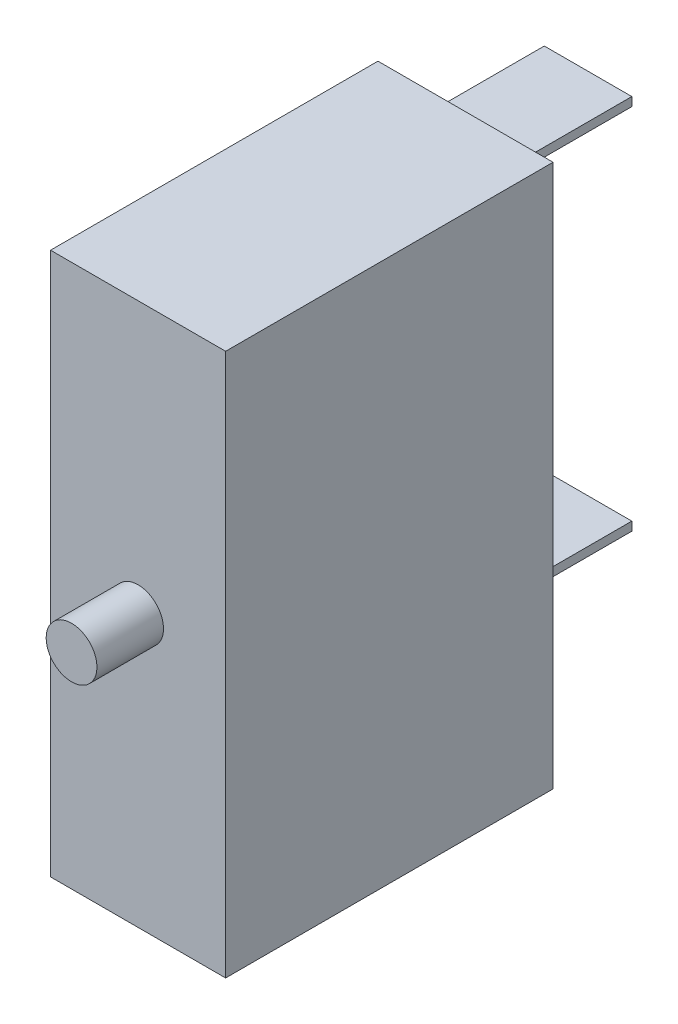
ISO-10303-21;
HEADER;
FILE_DESCRIPTION(('STEP AP214'),'2;1');
FILE_NAME('part.step','',(''),(''),'','','');
FILE_SCHEMA(('AUTOMOTIVE_DESIGN { 1 0 10303 214 1 1 1 1 }'));
ENDSEC;
DATA;
#1=APPLICATION_CONTEXT('core data for automotive mechanical design processes');
#2=APPLICATION_PROTOCOL_DEFINITION('international standard','automotive_design',2000,#1);
#3=PRODUCT_CONTEXT('',#1,'mechanical');
#4=PRODUCT('Part','Part','',(#3));
#5=PRODUCT_RELATED_PRODUCT_CATEGORY('part','',(#4));
#6=PRODUCT_DEFINITION_FORMATION('','',#4);
#7=PRODUCT_DEFINITION_CONTEXT('part definition',#1,'design');
#8=PRODUCT_DEFINITION('design','',#6,#7);
#9=PRODUCT_DEFINITION_SHAPE('','',#8);
#10=(LENGTH_UNIT() NAMED_UNIT(*) SI_UNIT(.MILLI.,.METRE.));
#11=(NAMED_UNIT(*) PLANE_ANGLE_UNIT() SI_UNIT($,.RADIAN.));
#12=(NAMED_UNIT(*) SI_UNIT($,.STERADIAN.) SOLID_ANGLE_UNIT());
#13=UNCERTAINTY_MEASURE_WITH_UNIT(LENGTH_MEASURE(1.E-05),#10,'distance_accuracy_value','');
#14=(GEOMETRIC_REPRESENTATION_CONTEXT(3) GLOBAL_UNCERTAINTY_ASSIGNED_CONTEXT((#13)) GLOBAL_UNIT_ASSIGNED_CONTEXT((#10,
#11,#12)) REPRESENTATION_CONTEXT('',''));
#15=CARTESIAN_POINT('',(0.,0.,0.));
#16=DIRECTION('',(0.,0.,1.));
#17=DIRECTION('',(1.,0.,0.));
#18=AXIS2_PLACEMENT_3D('',#15,#16,#17);
#19=CARTESIAN_POINT('',(-5.,-23.,-18.));
#20=DIRECTION('',(0.,0.,-1.));
#21=DIRECTION('',(-1.,0.,0.));
#22=AXIS2_PLACEMENT_3D('',#19,#20,#21);
#23=PLANE('',#22);
#24=DIRECTION('',(-1.,0.,0.));
#25=VECTOR('',#24,1.);
#26=CARTESIAN_POINT('',(5.,15.5,-18.));
#27=LINE('',#26,#25);
#28=CARTESIAN_POINT('',(5.,15.5,-18.));
#29=VERTEX_POINT('',#28);
#30=CARTESIAN_POINT('',(-5.,15.5,-18.));
#31=VERTEX_POINT('',#30);
#32=EDGE_CURVE('E158',#29,#31,#27,.T.);
#33=ORIENTED_EDGE('',*,*,#32,.F.);
#34=DIRECTION('',(0.,1.,0.));
#35=VECTOR('',#34,1.);
#36=CARTESIAN_POINT('',(5.,-23.,-18.));
#37=LINE('',#36,#35);
#38=CARTESIAN_POINT('',(5.,-15.5,-18.));
#39=VERTEX_POINT('',#38);
#40=EDGE_CURVE('E151',#39,#29,#37,.T.);
#41=ORIENTED_EDGE('',*,*,#40,.F.);
#42=DIRECTION('',(-1.,0.,0.));
#43=VECTOR('',#42,1.);
#44=CARTESIAN_POINT('',(5.,-15.5,-18.));
#45=LINE('',#44,#43);
#46=CARTESIAN_POINT('',(-5.,-15.5,-18.));
#47=VERTEX_POINT('',#46);
#48=EDGE_CURVE('E130',#39,#47,#45,.T.);
#49=ORIENTED_EDGE('',*,*,#48,.T.);
#50=DIRECTION('',(0.,1.,0.));
#51=VECTOR('',#50,1.);
#52=CARTESIAN_POINT('',(-5.,-23.,-18.));
#53=LINE('',#52,#51);
#54=EDGE_CURVE('E150',#47,#31,#53,.T.);
#55=ORIENTED_EDGE('',*,*,#54,.T.);
#56=EDGE_LOOP('',(#33,#41,#49,#55));
#57=FACE_BOUND('',#56,.T.);
#58=DIRECTION('',(-1.,0.,0.));
#59=VECTOR('',#58,1.);
#60=CARTESIAN_POINT('',(-2.5,-7.5,-18.));
#61=LINE('',#60,#59);
#62=CARTESIAN_POINT('',(2.5,-7.5,-18.));
#63=VERTEX_POINT('',#62);
#64=CARTESIAN_POINT('',(-2.5,-7.5,-18.));
#65=VERTEX_POINT('',#64);
#66=EDGE_CURVE('E179',#63,#65,#61,.T.);
#67=ORIENTED_EDGE('',*,*,#66,.F.);
#68=DIRECTION('',(0.,-1.,0.));
#69=VECTOR('',#68,1.);
#70=CARTESIAN_POINT('',(2.5,-7.5,-18.));
#71=LINE('',#70,#69);
#72=CARTESIAN_POINT('',(2.5,-7.,-18.));
#73=VERTEX_POINT('',#72);
#74=EDGE_CURVE('E181',#73,#63,#71,.T.);
#75=ORIENTED_EDGE('',*,*,#74,.F.);
#76=DIRECTION('',(1.,0.,0.));
#77=VECTOR('',#76,1.);
#78=CARTESIAN_POINT('',(2.5,-7.,-18.));
#79=LINE('',#78,#77);
#80=CARTESIAN_POINT('',(-2.5,-7.,-18.));
#81=VERTEX_POINT('',#80);
#82=EDGE_CURVE('E174',#81,#73,#79,.T.);
#83=ORIENTED_EDGE('',*,*,#82,.F.);
#84=DIRECTION('',(0.,1.,0.));
#85=VECTOR('',#84,1.);
#86=CARTESIAN_POINT('',(-2.5,-7.,-18.));
#87=LINE('',#86,#85);
#88=EDGE_CURVE('E177',#65,#81,#87,.T.);
#89=ORIENTED_EDGE('',*,*,#88,.F.);
#90=EDGE_LOOP('',(#67,#75,#83,#89));
#91=FACE_BOUND('',#90,.T.);
#92=DIRECTION('',(-1.,0.,0.));
#93=VECTOR('',#92,1.);
#94=CARTESIAN_POINT('',(-2.5,13.5,-18.));
#95=LINE('',#94,#93);
#96=CARTESIAN_POINT('',(2.5,13.5,-18.));
#97=VERTEX_POINT('',#96);
#98=CARTESIAN_POINT('',(-2.5,13.5,-18.));
#99=VERTEX_POINT('',#98);
#100=EDGE_CURVE('E206',#97,#99,#95,.T.);
#101=ORIENTED_EDGE('',*,*,#100,.F.);
#102=DIRECTION('',(0.,-1.,0.));
#103=VECTOR('',#102,1.);
#104=CARTESIAN_POINT('',(2.5,13.5,-18.));
#105=LINE('',#104,#103);
#106=CARTESIAN_POINT('',(2.5,14.,-18.));
#107=VERTEX_POINT('',#106);
#108=EDGE_CURVE('E208',#107,#97,#105,.T.);
#109=ORIENTED_EDGE('',*,*,#108,.F.);
#110=DIRECTION('',(1.,0.,0.));
#111=VECTOR('',#110,1.);
#112=CARTESIAN_POINT('',(2.5,14.,-18.));
#113=LINE('',#112,#111);
#114=CARTESIAN_POINT('',(-2.5,14.,-18.));
#115=VERTEX_POINT('',#114);
#116=EDGE_CURVE('E201',#115,#107,#113,.T.);
#117=ORIENTED_EDGE('',*,*,#116,.F.);
#118=DIRECTION('',(0.,1.,0.));
#119=VECTOR('',#118,1.);
#120=CARTESIAN_POINT('',(-2.5,14.,-18.));
#121=LINE('',#120,#119);
#122=EDGE_CURVE('E204',#99,#115,#121,.T.);
#123=ORIENTED_EDGE('',*,*,#122,.F.);
#124=EDGE_LOOP('',(#101,#109,#117,#123));
#125=FACE_BOUND('',#124,.T.);
#126=ADVANCED_FACE('F34',(#57,#91,#125),#23,.T.);
#127=CARTESIAN_POINT('',(-5.,23.,0.7));
#128=DIRECTION('',(0.,0.,1.));
#129=DIRECTION('',(1.,0.,0.));
#130=AXIS2_PLACEMENT_3D('',#127,#128,#129);
#131=PLANE('',#130);
#132=DIRECTION('',(1.,0.,0.));
#133=VECTOR('',#132,1.);
#134=CARTESIAN_POINT('',(-5.,15.5,0.7));
#135=LINE('',#134,#133);
#136=CARTESIAN_POINT('',(-5.,15.5,0.7));
#137=VERTEX_POINT('',#136);
#138=CARTESIAN_POINT('',(5.,15.5,0.7));
#139=VERTEX_POINT('',#138);
#140=EDGE_CURVE('E145',#137,#139,#135,.T.);
#141=ORIENTED_EDGE('',*,*,#140,.F.);
#142=DIRECTION('',(0.,-1.,0.));
#143=VECTOR('',#142,1.);
#144=CARTESIAN_POINT('',(-5.,23.,0.7));
#145=LINE('',#144,#143);
#146=CARTESIAN_POINT('',(-5.,-15.5,0.7));
#147=VERTEX_POINT('',#146);
#148=EDGE_CURVE('E41',#137,#147,#145,.T.);
#149=ORIENTED_EDGE('',*,*,#148,.T.);
#150=DIRECTION('',(-1.,0.,0.));
#151=VECTOR('',#150,1.);
#152=CARTESIAN_POINT('',(-5.,-15.5,0.7));
#153=LINE('',#152,#151);
#154=CARTESIAN_POINT('',(5.,-15.5,0.7));
#155=VERTEX_POINT('',#154);
#156=EDGE_CURVE('E127',#155,#147,#153,.T.);
#157=ORIENTED_EDGE('',*,*,#156,.F.);
#158=DIRECTION('',(0.,-1.,0.));
#159=VECTOR('',#158,1.);
#160=CARTESIAN_POINT('',(5.,23.,0.7));
#161=LINE('',#160,#159);
#162=EDGE_CURVE('E142',#139,#155,#161,.T.);
#163=ORIENTED_EDGE('',*,*,#162,.F.);
#164=EDGE_LOOP('',(#141,#149,#157,#163));
#165=FACE_BOUND('',#164,.T.);
#166=CARTESIAN_POINT('',(0.,0.,0.7));
#167=DIRECTION('',(0.,0.,1.));
#168=DIRECTION('',(1.,0.,0.));
#169=AXIS2_PLACEMENT_3D('',#166,#167,#168);
#170=CIRCLE('',#169,1.45);
#171=CARTESIAN_POINT('',(1.45,0.,0.7));
#172=VERTEX_POINT('',#171);
#173=EDGE_CURVE('E11',#172,#172,#170,.T.);
#174=ORIENTED_EDGE('',*,*,#173,.F.);
#175=EDGE_LOOP('',(#174));
#176=FACE_BOUND('',#175,.T.);
#177=ADVANCED_FACE('F140',(#165,#176),#131,.T.);
#178=CARTESIAN_POINT('',(-5.,0.,0.));
#179=DIRECTION('',(1.,0.,0.));
#180=DIRECTION('',(0.,0.,-1.));
#181=AXIS2_PLACEMENT_3D('',#178,#179,#180);
#182=PLANE('',#181);
#183=ORIENTED_EDGE('',*,*,#148,.F.);
#184=DIRECTION('',(0.,0.,1.));
#185=VECTOR('',#184,1.);
#186=CARTESIAN_POINT('',(-5.,15.5,-18.));
#187=LINE('',#186,#185);
#188=EDGE_CURVE('E161',#31,#137,#187,.T.);
#189=ORIENTED_EDGE('',*,*,#188,.F.);
#190=ORIENTED_EDGE('',*,*,#54,.F.);
#191=DIRECTION('',(0.,0.,-1.));
#192=VECTOR('',#191,1.);
#193=CARTESIAN_POINT('',(-5.,-15.5,0.));
#194=LINE('',#193,#192);
#195=EDGE_CURVE('E135',#147,#47,#194,.T.);
#196=ORIENTED_EDGE('',*,*,#195,.F.);
#197=EDGE_LOOP('',(#183,#189,#190,#196));
#198=FACE_BOUND('',#197,.T.);
#199=ADVANCED_FACE('F225',(#198),#182,.F.);
#200=CARTESIAN_POINT('',(5.,0.,0.));
#201=DIRECTION('',(1.,0.,0.));
#202=DIRECTION('',(0.,0.,-1.));
#203=AXIS2_PLACEMENT_3D('',#200,#201,#202);
#204=PLANE('',#203);
#205=DIRECTION('',(0.,0.,1.));
#206=VECTOR('',#205,1.);
#207=CARTESIAN_POINT('',(5.,15.5,-18.));
#208=LINE('',#207,#206);
#209=EDGE_CURVE('E148',#29,#139,#208,.T.);
#210=ORIENTED_EDGE('',*,*,#209,.T.);
#211=ORIENTED_EDGE('',*,*,#162,.T.);
#212=DIRECTION('',(0.,0.,-1.));
#213=VECTOR('',#212,1.);
#214=CARTESIAN_POINT('',(5.,-15.5,0.));
#215=LINE('',#214,#213);
#216=EDGE_CURVE('E124',#155,#39,#215,.T.);
#217=ORIENTED_EDGE('',*,*,#216,.T.);
#218=ORIENTED_EDGE('',*,*,#40,.T.);
#219=EDGE_LOOP('',(#210,#211,#217,#218));
#220=FACE_BOUND('',#219,.T.);
#221=ADVANCED_FACE('F147',(#220),#204,.T.);
#222=CARTESIAN_POINT('',(5.,-15.5,0.));
#223=DIRECTION('',(0.,1.,0.));
#224=DIRECTION('',(-1.,0.,0.));
#225=AXIS2_PLACEMENT_3D('',#222,#223,#224);
#226=PLANE('',#225);
#227=ORIENTED_EDGE('',*,*,#195,.T.);
#228=ORIENTED_EDGE('',*,*,#48,.F.);
#229=ORIENTED_EDGE('',*,*,#216,.F.);
#230=ORIENTED_EDGE('',*,*,#156,.T.);
#231=EDGE_LOOP('',(#227,#228,#229,#230));
#232=FACE_BOUND('',#231,.T.);
#233=ADVANCED_FACE('F126',(#232),#226,.F.);
#234=CARTESIAN_POINT('',(5.,15.5,-18.));
#235=DIRECTION('',(0.,-1.,0.));
#236=DIRECTION('',(1.,0.,0.));
#237=AXIS2_PLACEMENT_3D('',#234,#235,#236);
#238=PLANE('',#237);
#239=ORIENTED_EDGE('',*,*,#188,.T.);
#240=ORIENTED_EDGE('',*,*,#140,.T.);
#241=ORIENTED_EDGE('',*,*,#209,.F.);
#242=ORIENTED_EDGE('',*,*,#32,.T.);
#243=EDGE_LOOP('',(#239,#240,#241,#242));
#244=FACE_BOUND('',#243,.T.);
#245=ADVANCED_FACE('F221',(#244),#238,.F.);
#246=CARTESIAN_POINT('',(2.5,-7.5,-25.));
#247=DIRECTION('',(-1.,0.,0.));
#248=DIRECTION('',(0.,0.,1.));
#249=AXIS2_PLACEMENT_3D('',#246,#247,#248);
#250=PLANE('',#249);
#251=ORIENTED_EDGE('',*,*,#74,.T.);
#252=DIRECTION('',(0.,0.,1.));
#253=VECTOR('',#252,1.);
#254=CARTESIAN_POINT('',(2.5,-7.5,-25.));
#255=LINE('',#254,#253);
#256=CARTESIAN_POINT('',(2.5,-7.5,-25.));
#257=VERTEX_POINT('',#256);
#258=EDGE_CURVE('E163',#257,#63,#255,.T.);
#259=ORIENTED_EDGE('',*,*,#258,.F.);
#260=DIRECTION('',(0.,-1.,0.));
#261=VECTOR('',#260,1.);
#262=CARTESIAN_POINT('',(2.5,-7.5,-25.));
#263=LINE('',#262,#261);
#264=CARTESIAN_POINT('',(2.5,-7.,-25.));
#265=VERTEX_POINT('',#264);
#266=EDGE_CURVE('E176',#265,#257,#263,.T.);
#267=ORIENTED_EDGE('',*,*,#266,.F.);
#268=DIRECTION('',(0.,0.,1.));
#269=VECTOR('',#268,1.);
#270=CARTESIAN_POINT('',(2.5,-7.,-25.));
#271=LINE('',#270,#269);
#272=EDGE_CURVE('E170',#265,#73,#271,.T.);
#273=ORIENTED_EDGE('',*,*,#272,.T.);
#274=EDGE_LOOP('',(#251,#259,#267,#273));
#275=FACE_BOUND('',#274,.T.);
#276=ADVANCED_FACE('F281',(#275),#250,.F.);
#277=CARTESIAN_POINT('',(-2.5,-7.5,-25.));
#278=DIRECTION('',(0.,1.,0.));
#279=DIRECTION('',(-1.,0.,0.));
#280=AXIS2_PLACEMENT_3D('',#277,#278,#279);
#281=PLANE('',#280);
#282=ORIENTED_EDGE('',*,*,#66,.T.);
#283=DIRECTION('',(0.,0.,1.));
#284=VECTOR('',#283,1.);
#285=CARTESIAN_POINT('',(-2.5,-7.5,-25.));
#286=LINE('',#285,#284);
#287=CARTESIAN_POINT('',(-2.5,-7.5,-25.));
#288=VERTEX_POINT('',#287);
#289=EDGE_CURVE('E166',#288,#65,#286,.T.);
#290=ORIENTED_EDGE('',*,*,#289,.F.);
#291=DIRECTION('',(-1.,0.,0.));
#292=VECTOR('',#291,1.);
#293=CARTESIAN_POINT('',(-2.5,-7.5,-25.));
#294=LINE('',#293,#292);
#295=EDGE_CURVE('E188',#257,#288,#294,.T.);
#296=ORIENTED_EDGE('',*,*,#295,.F.);
#297=ORIENTED_EDGE('',*,*,#258,.T.);
#298=EDGE_LOOP('',(#282,#290,#296,#297));
#299=FACE_BOUND('',#298,.T.);
#300=ADVANCED_FACE('F277',(#299),#281,.F.);
#301=CARTESIAN_POINT('',(-2.5,-7.,-25.));
#302=DIRECTION('',(1.,0.,0.));
#303=DIRECTION('',(0.,0.,-1.));
#304=AXIS2_PLACEMENT_3D('',#301,#302,#303);
#305=PLANE('',#304);
#306=ORIENTED_EDGE('',*,*,#88,.T.);
#307=DIRECTION('',(0.,0.,1.));
#308=VECTOR('',#307,1.);
#309=CARTESIAN_POINT('',(-2.5,-7.,-25.));
#310=LINE('',#309,#308);
#311=CARTESIAN_POINT('',(-2.5,-7.,-25.));
#312=VERTEX_POINT('',#311);
#313=EDGE_CURVE('E56',#312,#81,#310,.T.);
#314=ORIENTED_EDGE('',*,*,#313,.F.);
#315=DIRECTION('',(0.,1.,0.));
#316=VECTOR('',#315,1.);
#317=CARTESIAN_POINT('',(-2.5,-7.,-25.));
#318=LINE('',#317,#316);
#319=EDGE_CURVE('E186',#288,#312,#318,.T.);
#320=ORIENTED_EDGE('',*,*,#319,.F.);
#321=ORIENTED_EDGE('',*,*,#289,.T.);
#322=EDGE_LOOP('',(#306,#314,#320,#321));
#323=FACE_BOUND('',#322,.T.);
#324=ADVANCED_FACE('F274',(#323),#305,.F.);
#325=CARTESIAN_POINT('',(2.5,-7.,-25.));
#326=DIRECTION('',(0.,-1.,0.));
#327=DIRECTION('',(0.,0.,-1.));
#328=AXIS2_PLACEMENT_3D('',#325,#326,#327);
#329=PLANE('',#328);
#330=ORIENTED_EDGE('',*,*,#82,.T.);
#331=ORIENTED_EDGE('',*,*,#272,.F.);
#332=DIRECTION('',(1.,0.,0.));
#333=VECTOR('',#332,1.);
#334=CARTESIAN_POINT('',(2.5,-7.,-25.));
#335=LINE('',#334,#333);
#336=EDGE_CURVE('E173',#312,#265,#335,.T.);
#337=ORIENTED_EDGE('',*,*,#336,.F.);
#338=ORIENTED_EDGE('',*,*,#313,.T.);
#339=EDGE_LOOP('',(#330,#331,#337,#338));
#340=FACE_BOUND('',#339,.T.);
#341=ADVANCED_FACE('F270',(#340),#329,.F.);
#342=CARTESIAN_POINT('',(0.,0.,-25.));
#343=DIRECTION('',(0.,0.,1.));
#344=DIRECTION('',(1.,0.,0.));
#345=AXIS2_PLACEMENT_3D('',#342,#343,#344);
#346=PLANE('',#345);
#347=ORIENTED_EDGE('',*,*,#266,.T.);
#348=ORIENTED_EDGE('',*,*,#295,.T.);
#349=ORIENTED_EDGE('',*,*,#319,.T.);
#350=ORIENTED_EDGE('',*,*,#336,.T.);
#351=EDGE_LOOP('',(#347,#348,#349,#350));
#352=FACE_BOUND('',#351,.T.);
#353=ADVANCED_FACE('F267',(#352),#346,.F.);
#354=CARTESIAN_POINT('',(2.5,13.5,-25.));
#355=DIRECTION('',(-1.,0.,0.));
#356=DIRECTION('',(0.,0.,1.));
#357=AXIS2_PLACEMENT_3D('',#354,#355,#356);
#358=PLANE('',#357);
#359=ORIENTED_EDGE('',*,*,#108,.T.);
#360=DIRECTION('',(0.,0.,1.));
#361=VECTOR('',#360,1.);
#362=CARTESIAN_POINT('',(2.5,13.5,-25.));
#363=LINE('',#362,#361);
#364=CARTESIAN_POINT('',(2.5,13.5,-25.));
#365=VERTEX_POINT('',#364);
#366=EDGE_CURVE('E184',#365,#97,#363,.T.);
#367=ORIENTED_EDGE('',*,*,#366,.F.);
#368=DIRECTION('',(0.,-1.,0.));
#369=VECTOR('',#368,1.);
#370=CARTESIAN_POINT('',(2.5,13.5,-25.));
#371=LINE('',#370,#369);
#372=CARTESIAN_POINT('',(2.5,14.,-25.));
#373=VERTEX_POINT('',#372);
#374=EDGE_CURVE('E203',#373,#365,#371,.T.);
#375=ORIENTED_EDGE('',*,*,#374,.F.);
#376=DIRECTION('',(0.,0.,1.));
#377=VECTOR('',#376,1.);
#378=CARTESIAN_POINT('',(2.5,14.,-25.));
#379=LINE('',#378,#377);
#380=EDGE_CURVE('E197',#373,#107,#379,.T.);
#381=ORIENTED_EDGE('',*,*,#380,.T.);
#382=EDGE_LOOP('',(#359,#367,#375,#381));
#383=FACE_BOUND('',#382,.T.);
#384=ADVANCED_FACE('F250',(#383),#358,.F.);
#385=CARTESIAN_POINT('',(-2.5,13.5,-25.));
#386=DIRECTION('',(0.,1.,0.));
#387=DIRECTION('',(0.,0.,1.));
#388=AXIS2_PLACEMENT_3D('',#385,#386,#387);
#389=PLANE('',#388);
#390=ORIENTED_EDGE('',*,*,#100,.T.);
#391=DIRECTION('',(0.,0.,1.));
#392=VECTOR('',#391,1.);
#393=CARTESIAN_POINT('',(-2.5,13.5,-25.));
#394=LINE('',#393,#392);
#395=CARTESIAN_POINT('',(-2.5,13.5,-25.));
#396=VERTEX_POINT('',#395);
#397=EDGE_CURVE('E193',#396,#99,#394,.T.);
#398=ORIENTED_EDGE('',*,*,#397,.F.);
#399=DIRECTION('',(-1.,0.,0.));
#400=VECTOR('',#399,1.);
#401=CARTESIAN_POINT('',(-2.5,13.5,-25.));
#402=LINE('',#401,#400);
#403=EDGE_CURVE('E214',#365,#396,#402,.T.);
#404=ORIENTED_EDGE('',*,*,#403,.F.);
#405=ORIENTED_EDGE('',*,*,#366,.T.);
#406=EDGE_LOOP('',(#390,#398,#404,#405));
#407=FACE_BOUND('',#406,.T.);
#408=ADVANCED_FACE('F240',(#407),#389,.F.);
#409=CARTESIAN_POINT('',(-2.5,14.,-25.));
#410=DIRECTION('',(1.,0.,0.));
#411=DIRECTION('',(0.,0.,-1.));
#412=AXIS2_PLACEMENT_3D('',#409,#410,#411);
#413=PLANE('',#412);
#414=ORIENTED_EDGE('',*,*,#122,.T.);
#415=DIRECTION('',(0.,0.,1.));
#416=VECTOR('',#415,1.);
#417=CARTESIAN_POINT('',(-2.5,14.,-25.));
#418=LINE('',#417,#416);
#419=CARTESIAN_POINT('',(-2.5,14.,-25.));
#420=VERTEX_POINT('',#419);
#421=EDGE_CURVE('E48',#420,#115,#418,.T.);
#422=ORIENTED_EDGE('',*,*,#421,.F.);
#423=DIRECTION('',(0.,1.,0.));
#424=VECTOR('',#423,1.);
#425=CARTESIAN_POINT('',(-2.5,14.,-25.));
#426=LINE('',#425,#424);
#427=EDGE_CURVE('E212',#396,#420,#426,.T.);
#428=ORIENTED_EDGE('',*,*,#427,.F.);
#429=ORIENTED_EDGE('',*,*,#397,.T.);
#430=EDGE_LOOP('',(#414,#422,#428,#429));
#431=FACE_BOUND('',#430,.T.);
#432=ADVANCED_FACE('F244',(#431),#413,.F.);
#433=CARTESIAN_POINT('',(2.5,14.,-25.));
#434=DIRECTION('',(0.,-1.,0.));
#435=DIRECTION('',(0.,0.,-1.));
#436=AXIS2_PLACEMENT_3D('',#433,#434,#435);
#437=PLANE('',#436);
#438=ORIENTED_EDGE('',*,*,#116,.T.);
#439=ORIENTED_EDGE('',*,*,#380,.F.);
#440=DIRECTION('',(1.,0.,0.));
#441=VECTOR('',#440,1.);
#442=CARTESIAN_POINT('',(2.5,14.,-25.));
#443=LINE('',#442,#441);
#444=EDGE_CURVE('E200',#420,#373,#443,.T.);
#445=ORIENTED_EDGE('',*,*,#444,.F.);
#446=ORIENTED_EDGE('',*,*,#421,.T.);
#447=EDGE_LOOP('',(#438,#439,#445,#446));
#448=FACE_BOUND('',#447,.T.);
#449=ADVANCED_FACE('F251',(#448),#437,.F.);
#450=CARTESIAN_POINT('',(0.,0.,-25.));
#451=DIRECTION('',(0.,0.,1.));
#452=DIRECTION('',(1.,0.,0.));
#453=AXIS2_PLACEMENT_3D('',#450,#451,#452);
#454=PLANE('',#453);
#455=ORIENTED_EDGE('',*,*,#374,.T.);
#456=ORIENTED_EDGE('',*,*,#403,.T.);
#457=ORIENTED_EDGE('',*,*,#427,.T.);
#458=ORIENTED_EDGE('',*,*,#444,.T.);
#459=EDGE_LOOP('',(#455,#456,#457,#458));
#460=FACE_BOUND('',#459,.T.);
#461=ADVANCED_FACE('F246',(#460),#454,.F.);
#462=CARTESIAN_POINT('',(0.,0.,4.5));
#463=DIRECTION('',(0.,0.,-1.));
#464=DIRECTION('',(-1.,0.,0.));
#465=AXIS2_PLACEMENT_3D('',#462,#463,#464);
#466=CYLINDRICAL_SURFACE('',#465,1.45);
#467=CARTESIAN_POINT('',(0.,0.,4.5));
#468=DIRECTION('',(0.,0.,-1.));
#469=DIRECTION('',(-1.,0.,0.));
#470=AXIS2_PLACEMENT_3D('',#467,#468,#469);
#471=CIRCLE('',#470,1.45);
#472=CARTESIAN_POINT('',(-1.45,0.,4.5));
#473=VERTEX_POINT('',#472);
#474=EDGE_CURVE('E144',#473,#473,#471,.T.);
#475=ORIENTED_EDGE('',*,*,#474,.T.);
#476=EDGE_LOOP('',(#475));
#477=FACE_BOUND('',#476,.T.);
#478=ORIENTED_EDGE('',*,*,#173,.T.);
#479=EDGE_LOOP('',(#478));
#480=FACE_BOUND('',#479,.T.);
#481=ADVANCED_FACE('F258',(#477,#480),#466,.T.);
#482=CARTESIAN_POINT('',(1.45,0.,4.5));
#483=DIRECTION('',(0.,0.,1.));
#484=DIRECTION('',(1.,0.,0.));
#485=AXIS2_PLACEMENT_3D('',#482,#483,#484);
#486=PLANE('',#485);
#487=ORIENTED_EDGE('',*,*,#474,.F.);
#488=EDGE_LOOP('',(#487));
#489=FACE_BOUND('',#488,.T.);
#490=ADVANCED_FACE('F366',(#489),#486,.T.);
#491=CLOSED_SHELL('',(#126,#177,#199,#221,#233,#245,#276,#300,#324,#341,#353,#384,#408,#432,
#449,#461,#481,#490));
#492=MANIFOLD_SOLID_BREP('B2',#491);
#493=ADVANCED_BREP_SHAPE_REPRESENTATION('',(#18,#492),#14);
#494=SHAPE_DEFINITION_REPRESENTATION(#9,#493);
ENDSEC;
END-ISO-10303-21;
